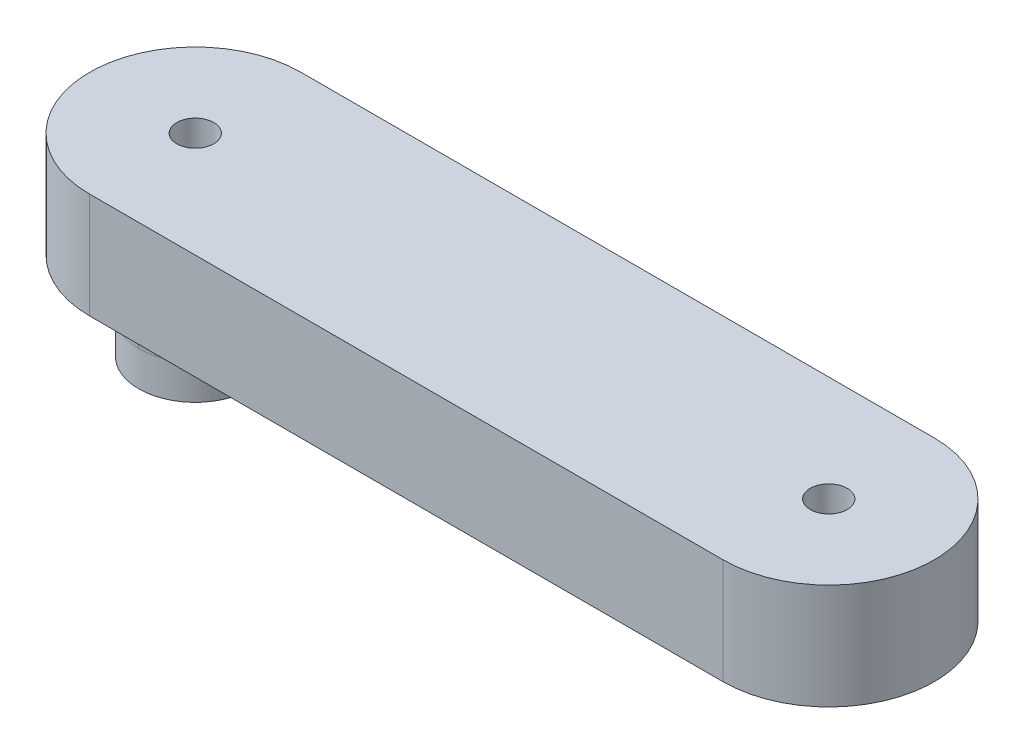
ISO-10303-21;
HEADER;
FILE_DESCRIPTION(('STEP AP214'),'2;1');
FILE_NAME('part.step','',(''),(''),'','','');
FILE_SCHEMA(('AUTOMOTIVE_DESIGN { 1 0 10303 214 1 1 1 1 }'));
ENDSEC;
DATA;
#1=APPLICATION_CONTEXT('core data for automotive mechanical design processes');
#2=APPLICATION_PROTOCOL_DEFINITION('international standard','automotive_design',2000,#1);
#3=PRODUCT_CONTEXT('',#1,'mechanical');
#4=PRODUCT('Part','Part','',(#3));
#5=PRODUCT_RELATED_PRODUCT_CATEGORY('part','',(#4));
#6=PRODUCT_DEFINITION_FORMATION('','',#4);
#7=PRODUCT_DEFINITION_CONTEXT('part definition',#1,'design');
#8=PRODUCT_DEFINITION('design','',#6,#7);
#9=PRODUCT_DEFINITION_SHAPE('','',#8);
#10=(LENGTH_UNIT() NAMED_UNIT(*) SI_UNIT(.MILLI.,.METRE.));
#11=(NAMED_UNIT(*) PLANE_ANGLE_UNIT() SI_UNIT($,.RADIAN.));
#12=(NAMED_UNIT(*) SI_UNIT($,.STERADIAN.) SOLID_ANGLE_UNIT());
#13=UNCERTAINTY_MEASURE_WITH_UNIT(LENGTH_MEASURE(1.E-05),#10,'distance_accuracy_value','');
#14=(GEOMETRIC_REPRESENTATION_CONTEXT(3) GLOBAL_UNCERTAINTY_ASSIGNED_CONTEXT((#13)) GLOBAL_UNIT_ASSIGNED_CONTEXT((#10,
#11,#12)) REPRESENTATION_CONTEXT('',''));
#15=CARTESIAN_POINT('',(0.,0.,0.));
#16=DIRECTION('',(0.,0.,1.));
#17=DIRECTION('',(1.,0.,0.));
#18=AXIS2_PLACEMENT_3D('',#15,#16,#17);
#19=CARTESIAN_POINT('',(-30.,10.,0.));
#20=DIRECTION('',(0.,-1.,0.));
#21=DIRECTION('',(0.,0.,1.));
#22=AXIS2_PLACEMENT_3D('',#19,#20,#21);
#23=CYLINDRICAL_SURFACE('',#22,10.);
#24=CARTESIAN_POINT('',(-30.,0.,0.));
#25=DIRECTION('',(0.,-1.,0.));
#26=DIRECTION('',(0.,0.,-1.));
#27=AXIS2_PLACEMENT_3D('',#24,#25,#26);
#28=CIRCLE('',#27,10.);
#29=CARTESIAN_POINT('',(-30.,0.,10.));
#30=VERTEX_POINT('',#29);
#31=CARTESIAN_POINT('',(-30.,0.,-10.));
#32=VERTEX_POINT('',#31);
#33=EDGE_CURVE('E149',#30,#32,#28,.T.);
#34=ORIENTED_EDGE('',*,*,#33,.F.);
#35=DIRECTION('',(0.,-1.,0.));
#36=VECTOR('',#35,1.);
#37=CARTESIAN_POINT('',(-30.,10.,10.));
#38=LINE('',#37,#36);
#39=CARTESIAN_POINT('',(-30.,10.,10.));
#40=VERTEX_POINT('',#39);
#41=EDGE_CURVE('E136',#40,#30,#38,.T.);
#42=ORIENTED_EDGE('',*,*,#41,.F.);
#43=CARTESIAN_POINT('',(-30.,10.,0.));
#44=DIRECTION('',(0.,-1.,0.));
#45=DIRECTION('',(0.,0.,-1.));
#46=AXIS2_PLACEMENT_3D('',#43,#44,#45);
#47=CIRCLE('',#46,10.);
#48=CARTESIAN_POINT('',(-30.,10.,-10.));
#49=VERTEX_POINT('',#48);
#50=EDGE_CURVE('E114',#40,#49,#47,.T.);
#51=ORIENTED_EDGE('',*,*,#50,.T.);
#52=DIRECTION('',(0.,-1.,0.));
#53=VECTOR('',#52,1.);
#54=CARTESIAN_POINT('',(-30.,10.,-10.));
#55=LINE('',#54,#53);
#56=EDGE_CURVE('E124',#49,#32,#55,.T.);
#57=ORIENTED_EDGE('',*,*,#56,.T.);
#58=EDGE_LOOP('',(#34,#42,#51,#57));
#59=FACE_BOUND('',#58,.T.);
#60=ADVANCED_FACE('F45',(#59),#23,.T.);
#61=CARTESIAN_POINT('',(-30.,10.,-10.));
#62=DIRECTION('',(0.,0.,1.));
#63=DIRECTION('',(-1.,0.,0.));
#64=AXIS2_PLACEMENT_3D('',#61,#62,#63);
#65=PLANE('',#64);
#66=DIRECTION('',(1.,0.,0.));
#67=VECTOR('',#66,1.);
#68=CARTESIAN_POINT('',(-30.,0.,-10.));
#69=LINE('',#68,#67);
#70=CARTESIAN_POINT('',(-27.3311987709835,0.,-10.));
#71=VERTEX_POINT('',#70);
#72=EDGE_CURVE('E128',#32,#71,#69,.T.);
#73=ORIENTED_EDGE('',*,*,#72,.F.);
#74=ORIENTED_EDGE('',*,*,#56,.F.);
#75=DIRECTION('',(1.,0.,0.));
#76=VECTOR('',#75,1.);
#77=CARTESIAN_POINT('',(-30.,10.,-10.));
#78=LINE('',#77,#76);
#79=CARTESIAN_POINT('',(30.,10.,-9.99999999999999));
#80=VERTEX_POINT('',#79);
#81=EDGE_CURVE('E110',#49,#80,#78,.T.);
#82=ORIENTED_EDGE('',*,*,#81,.T.);
#83=DIRECTION('',(0.,-1.,0.));
#84=VECTOR('',#83,1.);
#85=CARTESIAN_POINT('',(30.,10.,-9.99999999999999));
#86=LINE('',#85,#84);
#87=CARTESIAN_POINT('',(30.,0.,-9.99999999999999));
#88=VERTEX_POINT('',#87);
#89=EDGE_CURVE('E133',#80,#88,#86,.T.);
#90=ORIENTED_EDGE('',*,*,#89,.T.);
#91=EDGE_CURVE('E151',#71,#88,#69,.T.);
#92=ORIENTED_EDGE('',*,*,#91,.F.);
#93=EDGE_LOOP('',(#73,#74,#82,#90,#92));
#94=FACE_BOUND('',#93,.T.);
#95=ADVANCED_FACE('F125',(#94),#65,.F.);
#96=CARTESIAN_POINT('',(30.,10.,0.));
#97=DIRECTION('',(0.,-1.,0.));
#98=DIRECTION('',(0.,0.,1.));
#99=AXIS2_PLACEMENT_3D('',#96,#97,#98);
#100=CYLINDRICAL_SURFACE('',#99,10.);
#101=CARTESIAN_POINT('',(30.,0.,0.));
#102=DIRECTION('',(0.,-1.,0.));
#103=DIRECTION('',(0.,0.,-1.));
#104=AXIS2_PLACEMENT_3D('',#101,#102,#103);
#105=CIRCLE('',#104,10.);
#106=CARTESIAN_POINT('',(30.,0.,10.));
#107=VERTEX_POINT('',#106);
#108=EDGE_CURVE('E153',#88,#107,#105,.T.);
#109=ORIENTED_EDGE('',*,*,#108,.F.);
#110=ORIENTED_EDGE('',*,*,#89,.F.);
#111=CARTESIAN_POINT('',(30.,10.,0.));
#112=DIRECTION('',(0.,-1.,0.));
#113=DIRECTION('',(0.,0.,-1.));
#114=AXIS2_PLACEMENT_3D('',#111,#112,#113);
#115=CIRCLE('',#114,10.);
#116=CARTESIAN_POINT('',(30.,10.,10.));
#117=VERTEX_POINT('',#116);
#118=EDGE_CURVE('E117',#80,#117,#115,.T.);
#119=ORIENTED_EDGE('',*,*,#118,.T.);
#120=DIRECTION('',(0.,-1.,0.));
#121=VECTOR('',#120,1.);
#122=CARTESIAN_POINT('',(30.,10.,10.));
#123=LINE('',#122,#121);
#124=EDGE_CURVE('E157',#117,#107,#123,.T.);
#125=ORIENTED_EDGE('',*,*,#124,.T.);
#126=EDGE_LOOP('',(#109,#110,#119,#125));
#127=FACE_BOUND('',#126,.T.);
#128=ADVANCED_FACE('F231',(#127),#100,.T.);
#129=CARTESIAN_POINT('',(-30.,10.,10.));
#130=DIRECTION('',(0.,0.,-1.));
#131=DIRECTION('',(1.,0.,0.));
#132=AXIS2_PLACEMENT_3D('',#129,#130,#131);
#133=PLANE('',#132);
#134=DIRECTION('',(-1.,0.,0.));
#135=VECTOR('',#134,1.);
#136=CARTESIAN_POINT('',(-30.,0.,10.));
#137=LINE('',#136,#135);
#138=CARTESIAN_POINT('',(-27.3311987709835,0.,10.));
#139=VERTEX_POINT('',#138);
#140=EDGE_CURVE('E137',#107,#139,#137,.T.);
#141=ORIENTED_EDGE('',*,*,#140,.F.);
#142=ORIENTED_EDGE('',*,*,#124,.F.);
#143=DIRECTION('',(-1.,0.,0.));
#144=VECTOR('',#143,1.);
#145=CARTESIAN_POINT('',(-30.,10.,10.));
#146=LINE('',#145,#144);
#147=EDGE_CURVE('E147',#117,#40,#146,.T.);
#148=ORIENTED_EDGE('',*,*,#147,.T.);
#149=ORIENTED_EDGE('',*,*,#41,.T.);
#150=EDGE_CURVE('E140',#139,#30,#137,.T.);
#151=ORIENTED_EDGE('',*,*,#150,.F.);
#152=EDGE_LOOP('',(#141,#142,#148,#149,#151));
#153=FACE_BOUND('',#152,.T.);
#154=ADVANCED_FACE('F205',(#153),#133,.F.);
#155=CARTESIAN_POINT('',(-30.,10.,0.));
#156=DIRECTION('',(0.,1.,0.));
#157=DIRECTION('',(0.,0.,-1.));
#158=AXIS2_PLACEMENT_3D('',#155,#156,#157);
#159=PLANE('',#158);
#160=CARTESIAN_POINT('',(-30.,10.,0.));
#161=DIRECTION('',(0.,-1.,0.));
#162=DIRECTION('',(0.,0.,-1.));
#163=AXIS2_PLACEMENT_3D('',#160,#161,#162);
#164=CIRCLE('',#163,1.75);
#165=CARTESIAN_POINT('',(-30.,10.,-1.75));
#166=VERTEX_POINT('',#165);
#167=EDGE_CURVE('E349',#166,#166,#164,.F.);
#168=ORIENTED_EDGE('',*,*,#167,.F.);
#169=EDGE_LOOP('',(#168));
#170=FACE_BOUND('',#169,.T.);
#171=CARTESIAN_POINT('',(30.,10.,0.));
#172=DIRECTION('',(0.,-1.,0.));
#173=DIRECTION('',(0.,0.,-1.));
#174=AXIS2_PLACEMENT_3D('',#171,#172,#173);
#175=CIRCLE('',#174,1.75);
#176=CARTESIAN_POINT('',(30.,10.,-1.74999999999999));
#177=VERTEX_POINT('',#176);
#178=EDGE_CURVE('E359',#177,#177,#175,.T.);
#179=ORIENTED_EDGE('',*,*,#178,.T.);
#180=EDGE_LOOP('',(#179));
#181=FACE_BOUND('',#180,.T.);
#182=ORIENTED_EDGE('',*,*,#50,.F.);
#183=ORIENTED_EDGE('',*,*,#147,.F.);
#184=ORIENTED_EDGE('',*,*,#118,.F.);
#185=ORIENTED_EDGE('',*,*,#81,.F.);
#186=EDGE_LOOP('',(#182,#183,#184,#185));
#187=FACE_BOUND('',#186,.T.);
#188=ADVANCED_FACE('F112',(#170,#181,#187),#159,.T.);
#189=CARTESIAN_POINT('',(-30.,0.,0.));
#190=DIRECTION('',(0.,1.,0.));
#191=DIRECTION('',(0.,0.,-1.));
#192=AXIS2_PLACEMENT_3D('',#189,#190,#191);
#193=PLANE('',#192);
#194=CARTESIAN_POINT('',(30.,0.,0.));
#195=DIRECTION('',(0.,-1.,0.));
#196=DIRECTION('',(0.,0.,-1.));
#197=AXIS2_PLACEMENT_3D('',#194,#195,#196);
#198=CIRCLE('',#197,1.75);
#199=CARTESIAN_POINT('',(30.,0.,-1.74999999999999));
#200=VERTEX_POINT('',#199);
#201=EDGE_CURVE('E143',#200,#200,#198,.F.);
#202=ORIENTED_EDGE('',*,*,#201,.T.);
#203=EDGE_LOOP('',(#202));
#204=FACE_BOUND('',#203,.T.);
#205=ORIENTED_EDGE('',*,*,#91,.T.);
#206=ORIENTED_EDGE('',*,*,#108,.T.);
#207=ORIENTED_EDGE('',*,*,#140,.T.);
#208=CARTESIAN_POINT('',(-30.,0.,0.));
#209=DIRECTION('',(0.,-1.,0.));
#210=DIRECTION('',(0.,0.,-1.));
#211=AXIS2_PLACEMENT_3D('',#208,#209,#210);
#212=CIRCLE('',#211,10.35);
#213=EDGE_CURVE('E11',#71,#139,#212,.T.);
#214=ORIENTED_EDGE('',*,*,#213,.F.);
#215=EDGE_LOOP('',(#205,#206,#207,#214));
#216=FACE_BOUND('',#215,.T.);
#217=ADVANCED_FACE('F208',(#204,#216),#193,.F.);
#218=CARTESIAN_POINT('',(30.,-0.000999999999999265,0.));
#219=DIRECTION('',(0.,1.,0.));
#220=DIRECTION('',(0.,0.,-1.));
#221=AXIS2_PLACEMENT_3D('',#218,#219,#220);
#222=CYLINDRICAL_SURFACE('',#221,1.75);
#223=ORIENTED_EDGE('',*,*,#178,.F.);
#224=EDGE_LOOP('',(#223));
#225=FACE_BOUND('',#224,.T.);
#226=ORIENTED_EDGE('',*,*,#201,.F.);
#227=EDGE_LOOP('',(#226));
#228=FACE_BOUND('',#227,.T.);
#229=ADVANCED_FACE('F182',(#225,#228),#222,.F.);
#230=CARTESIAN_POINT('',(-30.,-8.3,0.));
#231=DIRECTION('',(0.,1.,0.));
#232=DIRECTION('',(0.,0.,-1.));
#233=AXIS2_PLACEMENT_3D('',#230,#231,#232);
#234=CYLINDRICAL_SURFACE('',#233,5.35);
#235=CARTESIAN_POINT('',(-30.,-5.,0.));
#236=DIRECTION('',(0.,-1.,0.));
#237=DIRECTION('',(0.,0.,-1.));
#238=AXIS2_PLACEMENT_3D('',#235,#236,#237);
#239=CIRCLE('',#238,5.35);
#240=CARTESIAN_POINT('',(-28.6204747270301,-5.,5.16908212560387));
#241=VERTEX_POINT('',#240);
#242=CARTESIAN_POINT('',(-28.6204747270301,-5.,-5.16908212560387));
#243=VERTEX_POINT('',#242);
#244=EDGE_CURVE('E132',#241,#243,#239,.F.);
#245=ORIENTED_EDGE('',*,*,#244,.F.);
#246=CARTESIAN_POINT('',(-31.9788555023003,0.,10.));
#247=CARTESIAN_POINT('',(-31.0518342041425,-0.151327584497428,5.24566626475481));
#248=CARTESIAN_POINT('',(-31.0228866606093,-4.99746914629356,5.25130487398585));
#249=CARTESIAN_POINT('',(-31.8416840938048,0.,10.));
#250=CARTESIAN_POINT('',(-30.9838925193806,-0.176275219698131,5.25932344975122));
#251=CARTESIAN_POINT('',(-30.9519816330296,-4.99661173471191,5.26511615605325));
#252=CARTESIAN_POINT('',(-31.7039879760669,0.,10.));
#253=CARTESIAN_POINT('',(-30.9139269500573,-0.198492678012402,5.27196649699026));
#254=CARTESIAN_POINT('',(-30.8808053789332,-4.9956432876798,5.27748969279492));
#255=CARTESIAN_POINT('',(-31.4277388486444,0.,10.));
#256=CARTESIAN_POINT('',(-30.7712171581687,-0.237452741214783,5.29471475920545));
#257=CARTESIAN_POINT('',(-30.7380099362557,-4.99369141658507,5.29934522958744));
#258=CARTESIAN_POINT('',(-31.2891858339339,0.,10.));
#259=CARTESIAN_POINT('',(-30.6984091257832,-0.254238109499984,5.30484226443355));
#260=CARTESIAN_POINT('',(-30.6663907450769,-4.99270799243456,5.30882721266284));
#261=CARTESIAN_POINT('',(-30.8726298347985,0.,10.));
#262=CARTESIAN_POINT('',(-30.4773319962797,-0.296564774639448,5.33077347696277));
#263=CARTESIAN_POINT('',(-30.4510695281324,-4.99004653847853,5.33290592711733));
#264=CARTESIAN_POINT('',(-30.5936336521263,0.,10.));
#265=CARTESIAN_POINT('',(-30.3252574445491,-0.314398026885512,5.34231726020473));
#266=CARTESIAN_POINT('',(-30.3068541100362,-4.98865643752529,5.34314510868886));
#267=CARTESIAN_POINT('',(-30.0421292001654,0.,10.));
#268=CARTESIAN_POINT('',(-30.0234398128161,-0.329434998305689,5.35201856702636));
#269=CARTESIAN_POINT('',(-30.0217769295541,-4.98749388985973,5.35180766924487));
#270=CARTESIAN_POINT('',(-29.7696373967144,0.,10.));
#271=CARTESIAN_POINT('',(-29.8731180834523,-0.327217293838508,5.35055142617128));
#272=CARTESIAN_POINT('',(-29.880923678495,-4.98768099912332,5.35052640691505));
#273=CARTESIAN_POINT('',(-29.2256849883891,0.,10.));
#274=CARTESIAN_POINT('',(-29.576495502657,-0.303458308736667,5.33532802825332));
#275=CARTESIAN_POINT('',(-29.5997502113895,-4.989470825283,5.33686337690267));
#276=CARTESIAN_POINT('',(-28.9542244296997,0.,10.));
#277=CARTESIAN_POINT('',(-29.4295879130413,-0.281817197515282,5.32150804622998));
#278=CARTESIAN_POINT('',(-29.4594300192165,-4.9910736048473,5.3244811178061));
#279=CARTESIAN_POINT('',(-28.3996316922226,0.,10.));
#280=CARTESIAN_POINT('',(-29.1377340144726,-0.216815216529235,5.28234281094893));
#281=CARTESIAN_POINT('',(-29.1727564785887,-4.99486237568772,5.28773553453734));
#282=CARTESIAN_POINT('',(-28.1166486098413,0.,10.));
#283=CARTESIAN_POINT('',(-28.9927750299324,-0.172067422348054,5.256259441982));
#284=CARTESIAN_POINT('',(-29.0264801992908,-4.99707489892725,5.2627687936572));
#285=CARTESIAN_POINT('',(-27.5556843173356,0.,10.));
#286=CARTESIAN_POINT('',(-28.7201965933415,-0.0589137193665707,5.19658457594004));
#287=CARTESIAN_POINT('',(-28.7365131495399,-4.99998286469731,5.20077750969058));
#288=CARTESIAN_POINT('',(-27.2777029505942,0.,10.));
#289=CARTESIAN_POINT('',(-28.5921846311864,0.0100164515104577,5.16277477656473));
#290=CARTESIAN_POINT('',(-28.5928222981303,-5.00067835481242,5.16375334484967));
#291=CARTESIAN_POINT('',(-26.720969453793,0.,10.));
#292=CARTESIAN_POINT('',(-28.3571871109459,0.175551584476238,5.09328951321567));
#293=CARTESIAN_POINT('',(-28.3050421814322,-4.99753497146377,5.07669446899849));
#294=CARTESIAN_POINT('',(-26.4424108985969,0.,10.));
#295=CARTESIAN_POINT('',(-28.2508597913106,0.273634993526017,5.05743919766299));
#296=CARTESIAN_POINT('',(-28.1610529765808,-4.99356945320689,5.02632655407054));
#297=CARTESIAN_POINT('',(-26.031737923125,0.,10.));
#298=CARTESIAN_POINT('',(-28.1172209488664,0.44057372083622,5.01123762346318));
#299=CARTESIAN_POINT('',(-27.9487727428785,-4.98091755986846,4.94173859701554));
#300=CARTESIAN_POINT('',(-25.8959926334928,0.,10.));
#301=CARTESIAN_POINT('',(-28.0766921001863,0.500169151962242,4.99699131325034));
#302=CARTESIAN_POINT('',(-27.8786048878471,-4.97557980590995,4.9120240472642));
#303=CARTESIAN_POINT('',(-25.6271790249498,0.,10.));
#304=CARTESIAN_POINT('',(-28.0050059401995,0.626198699088745,4.97275664154473));
#305=CARTESIAN_POINT('',(-27.7396529259375,-4.96203528700234,4.84965282784346));
#306=CARTESIAN_POINT('',(-25.4941111163786,0.,10.));
#307=CARTESIAN_POINT('',(-27.9739300041018,0.692765411267948,4.96280867491815));
#308=CARTESIAN_POINT('',(-27.6708690311674,-4.95382808576641,4.81699571133052));
#309=CARTESIAN_POINT('',(-25.3625284338882,0.,10.));
#310=CARTESIAN_POINT('',(-27.9482532363106,0.762217639042714,4.95601696890614));
#311=CARTESIAN_POINT('',(-27.6028528619615,-4.94387071662594,4.78290556028382));
#312=(BOUNDED_SURFACE() B_SPLINE_SURFACE(3,2,((#246,#247,#248),(#249,#250,#251),(#252,#253,
#254),(#255,#256,#257),(#258,#259,#260),(#261,#262,#263),(#264,#265,#266),(#267,#268,#269),
(#270,#271,#272),(#273,#274,#275),(#276,#277,#278),(#279,#280,#281),(#282,#283,#284),(#285,#286,
#287),(#288,#289,#290),(#291,#292,#293),(#294,#295,#296),(#297,#298,#299),(#300,#301,#302),
(#303,#304,#305),(#306,#307,#308),(#309,#310,#311)),.UNSPECIFIED.,.F.,.F.,
.F.) B_SPLINE_SURFACE_WITH_KNOTS((4,2,2,2,2,2,2,2,2,2,4),(3,3),(0.,0.419195440622884,
0.838393342170589,1.67649585344164,2.49317378017278,3.30988786102549,4.17013299968639,
5.03035115475905,5.91449315288709,6.35688857993052,6.7993513005261),(0.,1.),
.UNSPECIFIED.) GEOMETRIC_REPRESENTATION_ITEM() RATIONAL_B_SPLINE_SURFACE(((1.,0.718062116433734,
1.),(1.,0.719917164011899,1.),(1.,0.72158575518807,1.),(1.,0.72454097111007,1.),(1.,
0.725827593613473,1.),(1.,0.72910013465956,1.),(1.,0.730500037216757,1.),(1.,0.73168395531896,
1.),(1.,0.731508363306906,1.),(1.,0.729642437825001,1.),(1.,0.727952037298279,1.),(1.,
0.722966735302251,1.),(1.,0.71959111583058,1.),(1.,0.711296811271778,1.),(1.,0.706378174589809,
1.),(1.,0.694983923227657,1.),(1.,0.688468811289003,1.),(1.,0.677760266484751,1.),(1.,
0.674033234201927,1.),(1.,0.666305585787939,1.),(1.,0.662304928127688,1.),(1.,0.658187012948064,1.))) REPRESENTATION_ITEM('') SURFACE());
#313=CARTESIAN_POINT('',(-31.0228866606093,-4.99746914629356,5.25130487398585));
#314=CARTESIAN_POINT('',(-30.9519816330296,-4.99661173471191,5.26511615605325));
#315=CARTESIAN_POINT('',(-30.8808053789332,-4.9956432876798,5.27748969279492));
#316=CARTESIAN_POINT('',(-30.7380099362557,-4.99369141658507,5.29934522958744));
#317=CARTESIAN_POINT('',(-30.6663907450769,-4.99270799243456,5.30882721266284));
#318=CARTESIAN_POINT('',(-30.4510695281324,-4.99004653847853,5.33290592711733));
#319=CARTESIAN_POINT('',(-30.3068541100362,-4.98865643752529,5.34314510868887));
#320=CARTESIAN_POINT('',(-30.0217769295541,-4.98749388985973,5.35180766924487));
#321=CARTESIAN_POINT('',(-29.880923678495,-4.98768099912332,5.35052640691505));
#322=CARTESIAN_POINT('',(-29.5997502113895,-4.989470825283,5.33686337690267));
#323=CARTESIAN_POINT('',(-29.4594300192165,-4.9910736048473,5.3244811178061));
#324=CARTESIAN_POINT('',(-29.1727564785887,-4.99486237568772,5.28773553453734));
#325=CARTESIAN_POINT('',(-29.0264801992908,-4.99707489892725,5.2627687936572));
#326=CARTESIAN_POINT('',(-28.7365131495399,-4.99998286469731,5.20077750969058));
#327=CARTESIAN_POINT('',(-28.5928222981303,-5.00067835481242,5.16375334484967));
#328=CARTESIAN_POINT('',(-28.3050421814322,-4.99753497146377,5.07669446899849));
#329=CARTESIAN_POINT('',(-28.1610529765808,-4.99356945320689,5.02632655407054));
#330=CARTESIAN_POINT('',(-27.9487727428785,-4.98091755986846,4.94173859701554));
#331=CARTESIAN_POINT('',(-27.8786048878471,-4.97557980590995,4.9120240472642));
#332=CARTESIAN_POINT('',(-27.7396529259375,-4.96203528700234,4.84965282784346));
#333=CARTESIAN_POINT('',(-27.6708690311674,-4.95382808576641,4.81699571133052));
#334=CARTESIAN_POINT('',(-27.6028528619615,-4.94387071662594,4.78290556028382));
#335=B_SPLINE_CURVE_WITH_KNOTS('',3,(#313,#314,#315,#316,#317,#318,#319,#320,#321,#322,#323,
#324,#325,#326,#327,#328,#329,#330,#331,#332,#333,#334),.UNSPECIFIED.,.F.,.F.,(4,2,2,2,2,2,2,2,
2,2,4),(0.,0.419195440622884,0.838393342170589,1.67649585344164,2.49317378017278,
3.30988786102549,4.17013299968639,5.03035115475905,5.91449315288709,6.35688857993052,
6.7993513005261),.UNSPECIFIED.);
#336=CARTESIAN_POINT('',(-30.,-4.98773495687171,5.35));
#337=VERTEX_POINT('',#336);
#338=EDGE_CURVE('E162',#337,#241,#335,.T.);
#339=ORIENTED_EDGE('',*,*,#338,.F.);
#340=CARTESIAN_POINT('',(-30.,-4.98773495687171,0.));
#341=DIRECTION('',(0.,-1.,0.));
#342=DIRECTION('',(0.,0.,-1.));
#343=AXIS2_PLACEMENT_3D('',#340,#341,#342);
#344=CIRCLE('',#343,5.35);
#345=CARTESIAN_POINT('',(-30.,-4.98773495687171,-5.35));
#346=VERTEX_POINT('',#345);
#347=EDGE_CURVE('E170',#346,#337,#344,.F.);
#348=ORIENTED_EDGE('',*,*,#347,.F.);
#349=CARTESIAN_POINT('',(-24.982329250762,0.,-10.));
#350=CARTESIAN_POINT('',(-27.8879748506339,0.975498043250479,-4.94622203647995));
#351=CARTESIAN_POINT('',(-27.4063247817948,-4.90937934062816,-4.67924661270043));
#352=CARTESIAN_POINT('',(-25.1018149149591,0.,-10.));
#353=CARTESIAN_POINT('',(-27.9020255513305,0.90527144246055,-4.9457728156593));
#354=CARTESIAN_POINT('',(-27.468087902895,-4.92215702125141,-4.7134828290892));
#355=CARTESIAN_POINT('',(-25.2227372258345,0.,-10.));
#356=CARTESIAN_POINT('',(-27.9210674061778,0.837164866416158,-4.94901573193148));
#357=CARTESIAN_POINT('',(-27.5305936384705,-4.93311468699,-4.74652914754896));
#358=CARTESIAN_POINT('',(-25.4671924458317,0.,-10.));
#359=CARTESIAN_POINT('',(-27.9683167428165,0.706727456995853,-4.96116416599632));
#360=CARTESIAN_POINT('',(-27.6569545492993,-4.95194389528001,-4.81016000486057));
#361=CARTESIAN_POINT('',(-25.5907248833673,0.,-10.));
#362=CARTESIAN_POINT('',(-27.996430695619,0.644290788526217,-4.97000691203827));
#363=CARTESIAN_POINT('',(-27.7208094807857,-4.95981599037782,-4.84074498369482));
#364=CARTESIAN_POINT('',(-25.9646644125965,0.,-10.));
#365=CARTESIAN_POINT('',(-28.0928174155575,0.467291109513011,-5.00221179667532));
#366=CARTESIAN_POINT('',(-27.914101894452,-4.9796272877734,-4.92864537441296));
#367=CARTESIAN_POINT('',(-26.218648483424,0.,-10.));
#368=CARTESIAN_POINT('',(-28.1738131629906,0.36035783012853,-5.03140402812189));
#369=CARTESIAN_POINT('',(-28.045388346509,-4.9877843263485,-4.98217352822328));
#370=CARTESIAN_POINT('',(-26.7277497753456,0.,-10.));
#371=CARTESIAN_POINT('',(-28.3603007018644,0.174145036372328,-5.09358181809736));
#372=CARTESIAN_POINT('',(-28.3085469853189,-4.99768796878871,-5.07745985956556));
#373=CARTESIAN_POINT('',(-26.9826861426236,0.,-10.));
#374=CARTESIAN_POINT('',(-28.4649516265539,0.0935749025152531,-5.1264658155242));
#375=CARTESIAN_POINT('',(-28.4403256872486,-4.99958701406536,-5.11947470033271));
#376=CARTESIAN_POINT('',(-27.4981355022676,0.,-10.));
#377=CARTESIAN_POINT('',(-28.6933077655576,-0.0448370798064056,-5.18928403448164));
#378=CARTESIAN_POINT('',(-28.7067656944101,-5.00029124399043,-5.19318317312786));
#379=CARTESIAN_POINT('',(-27.7586494453069,0.,-10.));
#380=CARTESIAN_POINT('',(-28.8171590642594,-0.103227899936856,-5.21936847159637));
#381=CARTESIAN_POINT('',(-28.8414274910527,-4.99909589698226,-5.22487503048074));
#382=CARTESIAN_POINT('',(-28.2885221906525,0.,-10.));
#383=CARTESIAN_POINT('',(-29.0802845511431,-0.199835553334219,-5.27218728131988));
#384=CARTESIAN_POINT('',(-29.1153230647331,-4.99581213660066,-5.27822633599849));
#385=CARTESIAN_POINT('',(-28.5579553791874,0.,-10.));
#386=CARTESIAN_POINT('',(-29.2202075943135,-0.238070156897069,-5.29496276846834));
#387=CARTESIAN_POINT('',(-29.2545952926233,-4.99370752498329,-5.29968820730515));
#388=CARTESIAN_POINT('',(-29.0992422335306,0.,-10.));
#389=CARTESIAN_POINT('',(-29.5075631984335,-0.294212329057783,-5.3293078754699));
#390=CARTESIAN_POINT('',(-29.5343909129845,-4.99020537825828,-5.33156033600395));
#391=CARTESIAN_POINT('',(-29.371095809923,0.,-10.));
#392=CARTESIAN_POINT('',(-29.6555353138538,-0.312355351759313,-5.34101420045178));
#393=CARTESIAN_POINT('',(-29.6749142592356,-4.98880781713959,-5.34197099996452));
#394=CARTESIAN_POINT('',(-29.9225253777918,0.,-10.));
#395=CARTESIAN_POINT('',(-29.957101744159,-0.329418746312639,-5.35199488366776));
#396=CARTESIAN_POINT('',(-29.9599527315155,-4.98750073565178,-5.35179776405821));
#397=CARTESIAN_POINT('',(-30.2021216190016,0.,-10.));
#398=CARTESIAN_POINT('',(-30.111405781805,-0.327912126433172,-5.35099298670278));
#399=CARTESIAN_POINT('',(-30.1044783247979,-4.98763004344253,-5.35092692281945));
#400=CARTESIAN_POINT('',(-30.620677637691,0.,-10.));
#401=CARTESIAN_POINT('',(-30.3396172782977,-0.310420525479363,-5.33979122345231));
#402=CARTESIAN_POINT('',(-30.320833368275,-4.98894637096785,-5.340860003256));
#403=CARTESIAN_POINT('',(-30.7600818225309,0.,-10.));
#404=CARTESIAN_POINT('',(-30.4153552384296,-0.302025929414769,-5.33442455139388));
#405=CARTESIAN_POINT('',(-30.3928925362841,-4.98957242342615,-5.33604258314774));
#406=CARTESIAN_POINT('',(-31.0383967397009,0.,-10.));
#407=CARTESIAN_POINT('',(-30.5651430873869,-0.280067579465135,-5.3206780454283));
#408=CARTESIAN_POINT('',(-30.5367558026473,-4.99108186619892,-5.32349558536303));
#409=CARTESIAN_POINT('',(-31.1773074746799,0.,-10.));
#410=CARTESIAN_POINT('',(-30.6392701624221,-0.266479800947126,-5.31228369439717));
#411=CARTESIAN_POINT('',(-30.6085599023708,-4.99196525512985,-5.31576602334332));
#412=CARTESIAN_POINT('',(-31.3158737889103,0.,-10.));
#413=CARTESIAN_POINT('',(-30.7120499996823,-0.250271465370146,-5.30250099440117));
#414=CARTESIAN_POINT('',(-30.6801859681807,-4.99291881518917,-5.3065852531256));
#415=(BOUNDED_SURFACE() B_SPLINE_SURFACE(3,2,((#349,#350,#351),(#352,#353,#354),(#355,#356,
#357),(#358,#359,#360),(#361,#362,#363),(#364,#365,#366),(#367,#368,#369),(#370,#371,#372),
(#373,#374,#375),(#376,#377,#378),(#379,#380,#381),(#382,#383,#384),(#385,#386,#387),(#388,#389,
#390),(#391,#392,#393),(#394,#395,#396),(#397,#398,#399),(#400,#401,#402),(#403,#404,#405),
(#406,#407,#408),(#409,#410,#411),(#412,#413,#414)),.UNSPECIFIED.,.F.,.F.,
.F.) B_SPLINE_SURFACE_WITH_KNOTS((4,2,2,2,2,2,2,2,2,2,4),(3,3),(0.,0.411542741492993,
0.823011752553321,1.645144449525,2.44709631854861,3.24918598240891,4.06619522460137,
4.88317440838842,5.72097312572852,6.14002468851432,6.55907399835985),(0.,1.),
.UNSPECIFIED.) GEOMETRIC_REPRESENTATION_ITEM() RATIONAL_B_SPLINE_SURFACE(((1.,0.645846913338497,
1.),(1.,0.649862634729996,1.),(1.,0.653798780730085,1.),(1.,0.661474206336515,1.),(1.,
0.665213521086353,1.),(1.,0.676074699999644,1.),(1.,0.682847801331046,1.),(1.,0.695078749137499,
1.),(1.,0.700564799930277,1.),(1.,0.710281907038307,1.),(1.,0.714512747553014,1.),(1.,
0.721677506720577,1.),(1.,0.724585837636818,1.),(1.,0.728916944876098,1.),(1.,0.730339775849909,
1.),(1.,0.731682421614335,1.),(1.,0.731563010207267,1.),(1.,0.730188276238598,1.),(1.,
0.72953053405369,1.),(1.,0.727821334129289,1.),(1.,0.726769878506541,1.),(1.,0.725524091352782,1.))) REPRESENTATION_ITEM('') SURFACE());
#416=CARTESIAN_POINT('',(-27.4063247817948,-4.90937934062816,-4.67924661270043));
#417=CARTESIAN_POINT('',(-27.468087902895,-4.92215702125141,-4.7134828290892));
#418=CARTESIAN_POINT('',(-27.5305936384705,-4.93311468699,-4.74652914754896));
#419=CARTESIAN_POINT('',(-27.6569545492993,-4.95194389528001,-4.81016000486057));
#420=CARTESIAN_POINT('',(-27.7208094807857,-4.95981599037782,-4.84074498369482));
#421=CARTESIAN_POINT('',(-27.914101894452,-4.9796272877734,-4.92864537441296));
#422=CARTESIAN_POINT('',(-28.045388346509,-4.9877843263485,-4.98217352822328));
#423=CARTESIAN_POINT('',(-28.3085469853189,-4.99768796878871,-5.07745985956556));
#424=CARTESIAN_POINT('',(-28.4403256872486,-4.99958701406536,-5.11947470033271));
#425=CARTESIAN_POINT('',(-28.7067656944101,-5.00029124399043,-5.19318317312786));
#426=CARTESIAN_POINT('',(-28.8414274910527,-4.99909589698226,-5.22487503048074));
#427=CARTESIAN_POINT('',(-29.1153230647331,-4.99581213660066,-5.27822633599849));
#428=CARTESIAN_POINT('',(-29.2545952926233,-4.99370752498329,-5.29968820730515));
#429=CARTESIAN_POINT('',(-29.5343909129845,-4.99020537825828,-5.33156033600395));
#430=CARTESIAN_POINT('',(-29.6749142592356,-4.98880781713959,-5.34197099996452));
#431=CARTESIAN_POINT('',(-29.9599527315155,-4.98750073565178,-5.35179776405821));
#432=CARTESIAN_POINT('',(-30.1044783247979,-4.98763004344254,-5.35092692281945));
#433=CARTESIAN_POINT('',(-30.320833368275,-4.98894637096785,-5.340860003256));
#434=CARTESIAN_POINT('',(-30.3928925362841,-4.98957242342615,-5.33604258314774));
#435=CARTESIAN_POINT('',(-30.5367558026473,-4.99108186619892,-5.32349558536303));
#436=CARTESIAN_POINT('',(-30.6085599023708,-4.99196525512985,-5.31576602334332));
#437=CARTESIAN_POINT('',(-30.6801859681807,-4.99291881518917,-5.3065852531256));
#438=B_SPLINE_CURVE_WITH_KNOTS('',3,(#416,#417,#418,#419,#420,#421,#422,#423,#424,#425,#426,
#427,#428,#429,#430,#431,#432,#433,#434,#435,#436,#437),.UNSPECIFIED.,.F.,.F.,(4,2,2,2,2,2,2,2,
2,2,4),(0.,0.411542741492993,0.823011752553321,1.645144449525,2.44709631854861,3.24918598240891,
4.06619522460137,4.88317440838842,5.72097312572852,6.14002468851432,6.55907399835985),.UNSPECIFIED.);
#439=EDGE_CURVE('E58',#243,#346,#438,.T.);
#440=ORIENTED_EDGE('',*,*,#439,.F.);
#441=EDGE_LOOP('',(#245,#339,#348,#440));
#442=FACE_BOUND('',#441,.T.);
#443=CARTESIAN_POINT('',(-30.,-8.3,0.));
#444=DIRECTION('',(0.,1.,0.));
#445=DIRECTION('',(0.,0.,1.));
#446=AXIS2_PLACEMENT_3D('',#443,#444,#445);
#447=CIRCLE('',#446,5.35);
#448=CARTESIAN_POINT('',(-30.,-8.3,5.35));
#449=VERTEX_POINT('',#448);
#450=EDGE_CURVE('E213',#449,#449,#447,.T.);
#451=ORIENTED_EDGE('',*,*,#450,.T.);
#452=EDGE_LOOP('',(#451));
#453=FACE_BOUND('',#452,.T.);
#454=ADVANCED_FACE('F176',(#442,#453),#234,.T.);
#455=CARTESIAN_POINT('',(-30.,-8.3,0.));
#456=DIRECTION('',(0.,-1.,0.));
#457=DIRECTION('',(0.,0.,1.));
#458=AXIS2_PLACEMENT_3D('',#455,#456,#457);
#459=PLANE('',#458);
#460=CARTESIAN_POINT('',(-30.,-8.3,0.));
#461=DIRECTION('',(0.,1.,0.));
#462=DIRECTION('',(0.,0.,1.));
#463=AXIS2_PLACEMENT_3D('',#460,#461,#462);
#464=CIRCLE('',#463,1.75);
#465=CARTESIAN_POINT('',(-30.,-8.3,1.75));
#466=VERTEX_POINT('',#465);
#467=EDGE_CURVE('E352',#466,#466,#464,.T.);
#468=ORIENTED_EDGE('',*,*,#467,.T.);
#469=EDGE_LOOP('',(#468));
#470=FACE_BOUND('',#469,.T.);
#471=ORIENTED_EDGE('',*,*,#450,.F.);
#472=EDGE_LOOP('',(#471));
#473=FACE_BOUND('',#472,.T.);
#474=ADVANCED_FACE('F181',(#470,#473),#459,.T.);
#475=CARTESIAN_POINT('',(-30.,-4.98773495687171,10.35));
#476=DIRECTION('',(1.,0.,0.));
#477=DIRECTION('',(0.,-1.,0.));
#478=AXIS2_PLACEMENT_3D('',#475,#476,#477);
#479=CIRCLE('',#478,5.);
#480=EDGE_CURVE('E214',#30,#337,#479,.F.);
#481=ORIENTED_EDGE('',*,*,#480,.T.);
#482=ORIENTED_EDGE('',*,*,#338,.T.);
#483=CARTESIAN_POINT('',(-27.3311987709835,-5.,10.));
#484=DIRECTION('',(0.966183574879227,0.,-0.257855191209324));
#485=DIRECTION('',(-0.257855191209324,0.,-0.966183574879227));
#486=AXIS2_PLACEMENT_3D('',#483,#484,#485);
#487=CIRCLE('',#486,5.);
#488=EDGE_CURVE('E73',#241,#139,#487,.T.);
#489=ORIENTED_EDGE('',*,*,#488,.T.);
#490=ORIENTED_EDGE('',*,*,#150,.T.);
#491=EDGE_LOOP('',(#481,#482,#489,#490));
#492=FACE_BOUND('',#491,.T.);
#493=ADVANCED_FACE('F194',(#492),#312,.F.);
#494=CARTESIAN_POINT('',(-30.,-5.,0.));
#495=DIRECTION('',(0.,1.,0.));
#496=DIRECTION('',(0.,0.,-1.));
#497=AXIS2_PLACEMENT_3D('',#494,#495,#496);
#498=TOROIDAL_SURFACE('',#497,10.35,5.);
#499=ORIENTED_EDGE('',*,*,#488,.F.);
#500=ORIENTED_EDGE('',*,*,#244,.T.);
#501=CARTESIAN_POINT('',(-27.3311987709835,-5.,-10.));
#502=DIRECTION('',(-0.966183574879227,0.,-0.257855191209325));
#503=DIRECTION('',(-0.257855191209325,0.,0.966183574879227));
#504=AXIS2_PLACEMENT_3D('',#501,#502,#503);
#505=CIRCLE('',#504,5.);
#506=EDGE_CURVE('E65',#243,#71,#505,.T.);
#507=ORIENTED_EDGE('',*,*,#506,.T.);
#508=ORIENTED_EDGE('',*,*,#213,.T.);
#509=EDGE_LOOP('',(#499,#500,#507,#508));
#510=FACE_BOUND('',#509,.T.);
#511=ADVANCED_FACE('F199',(#510),#498,.F.);
#512=CARTESIAN_POINT('',(-30.,-4.98773495687171,0.));
#513=DIRECTION('',(0.,1.,0.));
#514=DIRECTION('',(0.,0.,-1.));
#515=AXIS2_PLACEMENT_3D('',#512,#513,#514);
#516=TOROIDAL_SURFACE('',#515,10.35,5.);
#517=ORIENTED_EDGE('',*,*,#480,.F.);
#518=ORIENTED_EDGE('',*,*,#33,.T.);
#519=CARTESIAN_POINT('',(-30.,-4.98773495687171,-10.35));
#520=DIRECTION('',(1.,0.,0.));
#521=DIRECTION('',(0.,0.,-1.));
#522=AXIS2_PLACEMENT_3D('',#519,#520,#521);
#523=CIRCLE('',#522,5.);
#524=EDGE_CURVE('E353',#32,#346,#523,.T.);
#525=ORIENTED_EDGE('',*,*,#524,.T.);
#526=ORIENTED_EDGE('',*,*,#347,.T.);
#527=EDGE_LOOP('',(#517,#518,#525,#526));
#528=FACE_BOUND('',#527,.T.);
#529=ADVANCED_FACE('F299',(#528),#516,.F.);
#530=ORIENTED_EDGE('',*,*,#506,.F.);
#531=ORIENTED_EDGE('',*,*,#439,.T.);
#532=ORIENTED_EDGE('',*,*,#524,.F.);
#533=ORIENTED_EDGE('',*,*,#72,.T.);
#534=EDGE_LOOP('',(#530,#531,#532,#533));
#535=FACE_BOUND('',#534,.T.);
#536=ADVANCED_FACE('F189',(#535),#415,.F.);
#537=CARTESIAN_POINT('',(-30.,10.001,0.));
#538=DIRECTION('',(0.,-1.,0.));
#539=DIRECTION('',(0.,0.,1.));
#540=AXIS2_PLACEMENT_3D('',#537,#538,#539);
#541=CYLINDRICAL_SURFACE('',#540,1.75);
#542=ORIENTED_EDGE('',*,*,#167,.T.);
#543=EDGE_LOOP('',(#542));
#544=FACE_BOUND('',#543,.T.);
#545=ORIENTED_EDGE('',*,*,#467,.F.);
#546=EDGE_LOOP('',(#545));
#547=FACE_BOUND('',#546,.T.);
#548=ADVANCED_FACE('F313',(#544,#547),#541,.F.);
#549=CLOSED_SHELL('',(#60,#95,#128,#154,#188,#217,#229,#454,#474,#493,#511,#529,#536,#548));
#550=MANIFOLD_SOLID_BREP('B2',#549);
#551=ADVANCED_BREP_SHAPE_REPRESENTATION('',(#18,#550),#14);
#552=SHAPE_DEFINITION_REPRESENTATION(#9,#551);
ENDSEC;
END-ISO-10303-21;
